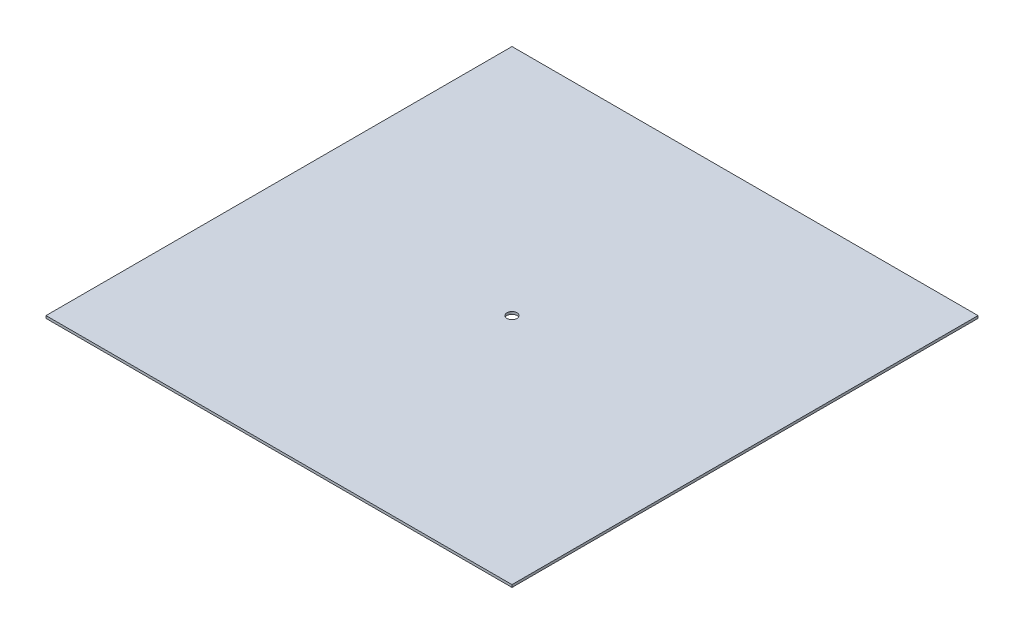
ISO-10303-21;
HEADER;
FILE_DESCRIPTION(('STEP AP214'),'2;1');
FILE_NAME('part.step','',(''),(''),'','','');
FILE_SCHEMA(('AUTOMOTIVE_DESIGN { 1 0 10303 214 1 1 1 1 }'));
ENDSEC;
DATA;
#1=APPLICATION_CONTEXT('core data for automotive mechanical design processes');
#2=APPLICATION_PROTOCOL_DEFINITION('international standard','automotive_design',2000,#1);
#3=PRODUCT_CONTEXT('',#1,'mechanical');
#4=PRODUCT('Part','Part','',(#3));
#5=PRODUCT_RELATED_PRODUCT_CATEGORY('part','',(#4));
#6=PRODUCT_DEFINITION_FORMATION('','',#4);
#7=PRODUCT_DEFINITION_CONTEXT('part definition',#1,'design');
#8=PRODUCT_DEFINITION('design','',#6,#7);
#9=PRODUCT_DEFINITION_SHAPE('','',#8);
#10=(LENGTH_UNIT() NAMED_UNIT(*) SI_UNIT(.MILLI.,.METRE.));
#11=(NAMED_UNIT(*) PLANE_ANGLE_UNIT() SI_UNIT($,.RADIAN.));
#12=(NAMED_UNIT(*) SI_UNIT($,.STERADIAN.) SOLID_ANGLE_UNIT());
#13=UNCERTAINTY_MEASURE_WITH_UNIT(LENGTH_MEASURE(1.E-05),#10,'distance_accuracy_value','');
#14=(GEOMETRIC_REPRESENTATION_CONTEXT(3) GLOBAL_UNCERTAINTY_ASSIGNED_CONTEXT((#13)) GLOBAL_UNIT_ASSIGNED_CONTEXT((#10,
#11,#12)) REPRESENTATION_CONTEXT('',''));
#15=CARTESIAN_POINT('',(0.,0.,0.));
#16=DIRECTION('',(0.,0.,1.));
#17=DIRECTION('',(1.,0.,0.));
#18=AXIS2_PLACEMENT_3D('',#15,#16,#17);
#19=CARTESIAN_POINT('',(-152.4,1.6256,-152.4));
#20=DIRECTION('',(1.,0.,0.));
#21=DIRECTION('',(0.,0.,-1.));
#22=AXIS2_PLACEMENT_3D('',#19,#20,#21);
#23=PLANE('',#22);
#24=DIRECTION('',(0.,0.,1.));
#25=VECTOR('',#24,1.);
#26=CARTESIAN_POINT('',(-152.4,0.,-152.4));
#27=LINE('',#26,#25);
#28=CARTESIAN_POINT('',(-152.4,0.,-152.4));
#29=VERTEX_POINT('',#28);
#30=CARTESIAN_POINT('',(-152.4,0.,152.4));
#31=VERTEX_POINT('',#30);
#32=EDGE_CURVE('E96',#29,#31,#27,.T.);
#33=ORIENTED_EDGE('',*,*,#32,.T.);
#34=DIRECTION('',(0.,-1.,0.));
#35=VECTOR('',#34,1.);
#36=CARTESIAN_POINT('',(-152.4,1.6256,152.4));
#37=LINE('',#36,#35);
#38=CARTESIAN_POINT('',(-152.4,1.6256,152.4));
#39=VERTEX_POINT('',#38);
#40=EDGE_CURVE('E11',#39,#31,#37,.T.);
#41=ORIENTED_EDGE('',*,*,#40,.F.);
#42=DIRECTION('',(0.,0.,1.));
#43=VECTOR('',#42,1.);
#44=CARTESIAN_POINT('',(-152.4,1.6256,-152.4));
#45=LINE('',#44,#43);
#46=CARTESIAN_POINT('',(-152.4,1.6256,-152.4));
#47=VERTEX_POINT('',#46);
#48=EDGE_CURVE('E84',#47,#39,#45,.T.);
#49=ORIENTED_EDGE('',*,*,#48,.F.);
#50=DIRECTION('',(0.,-1.,0.));
#51=VECTOR('',#50,1.);
#52=CARTESIAN_POINT('',(-152.4,1.6256,-152.4));
#53=LINE('',#52,#51);
#54=EDGE_CURVE('E92',#47,#29,#53,.T.);
#55=ORIENTED_EDGE('',*,*,#54,.T.);
#56=EDGE_LOOP('',(#33,#41,#49,#55));
#57=FACE_BOUND('',#56,.T.);
#58=ADVANCED_FACE('F33',(#57),#23,.F.);
#59=CARTESIAN_POINT('',(152.4,1.6256,152.4));
#60=DIRECTION('',(0.,0.,-1.));
#61=DIRECTION('',(-1.,0.,0.));
#62=AXIS2_PLACEMENT_3D('',#59,#60,#61);
#63=PLANE('',#62);
#64=DIRECTION('',(1.,0.,0.));
#65=VECTOR('',#64,1.);
#66=CARTESIAN_POINT('',(152.4,0.,152.4));
#67=LINE('',#66,#65);
#68=CARTESIAN_POINT('',(152.4,0.,152.4));
#69=VERTEX_POINT('',#68);
#70=EDGE_CURVE('E88',#31,#69,#67,.T.);
#71=ORIENTED_EDGE('',*,*,#70,.T.);
#72=DIRECTION('',(0.,-1.,0.));
#73=VECTOR('',#72,1.);
#74=CARTESIAN_POINT('',(152.4,1.6256,152.4));
#75=LINE('',#74,#73);
#76=CARTESIAN_POINT('',(152.4,1.6256,152.4));
#77=VERTEX_POINT('',#76);
#78=EDGE_CURVE('E41',#77,#69,#75,.T.);
#79=ORIENTED_EDGE('',*,*,#78,.F.);
#80=DIRECTION('',(1.,0.,0.));
#81=VECTOR('',#80,1.);
#82=CARTESIAN_POINT('',(152.4,1.6256,152.4));
#83=LINE('',#82,#81);
#84=EDGE_CURVE('E79',#39,#77,#83,.T.);
#85=ORIENTED_EDGE('',*,*,#84,.F.);
#86=ORIENTED_EDGE('',*,*,#40,.T.);
#87=EDGE_LOOP('',(#71,#79,#85,#86));
#88=FACE_BOUND('',#87,.T.);
#89=ADVANCED_FACE('F87',(#88),#63,.F.);
#90=CARTESIAN_POINT('',(152.4,1.6256,-152.4));
#91=DIRECTION('',(-1.,0.,0.));
#92=DIRECTION('',(0.,0.,1.));
#93=AXIS2_PLACEMENT_3D('',#90,#91,#92);
#94=PLANE('',#93);
#95=DIRECTION('',(0.,0.,-1.));
#96=VECTOR('',#95,1.);
#97=CARTESIAN_POINT('',(152.4,0.,-152.4));
#98=LINE('',#97,#96);
#99=CARTESIAN_POINT('',(152.4,0.,-152.4));
#100=VERTEX_POINT('',#99);
#101=EDGE_CURVE('E66',#69,#100,#98,.T.);
#102=ORIENTED_EDGE('',*,*,#101,.T.);
#103=DIRECTION('',(0.,-1.,0.));
#104=VECTOR('',#103,1.);
#105=CARTESIAN_POINT('',(152.4,1.6256,-152.4));
#106=LINE('',#105,#104);
#107=CARTESIAN_POINT('',(152.4,1.6256,-152.4));
#108=VERTEX_POINT('',#107);
#109=EDGE_CURVE('E89',#108,#100,#106,.T.);
#110=ORIENTED_EDGE('',*,*,#109,.F.);
#111=DIRECTION('',(0.,0.,-1.));
#112=VECTOR('',#111,1.);
#113=CARTESIAN_POINT('',(152.4,1.6256,-152.4));
#114=LINE('',#113,#112);
#115=EDGE_CURVE('E82',#77,#108,#114,.T.);
#116=ORIENTED_EDGE('',*,*,#115,.F.);
#117=ORIENTED_EDGE('',*,*,#78,.T.);
#118=EDGE_LOOP('',(#102,#110,#116,#117));
#119=FACE_BOUND('',#118,.T.);
#120=ADVANCED_FACE('F90',(#119),#94,.F.);
#121=CARTESIAN_POINT('',(152.4,1.6256,-152.4));
#122=DIRECTION('',(0.,0.,1.));
#123=DIRECTION('',(1.,0.,0.));
#124=AXIS2_PLACEMENT_3D('',#121,#122,#123);
#125=PLANE('',#124);
#126=DIRECTION('',(-1.,0.,0.));
#127=VECTOR('',#126,1.);
#128=CARTESIAN_POINT('',(152.4,0.,-152.4));
#129=LINE('',#128,#127);
#130=EDGE_CURVE('E72',#100,#29,#129,.T.);
#131=ORIENTED_EDGE('',*,*,#130,.T.);
#132=ORIENTED_EDGE('',*,*,#54,.F.);
#133=DIRECTION('',(-1.,0.,0.));
#134=VECTOR('',#133,1.);
#135=CARTESIAN_POINT('',(152.4,1.6256,-152.4));
#136=LINE('',#135,#134);
#137=EDGE_CURVE('E49',#108,#47,#136,.T.);
#138=ORIENTED_EDGE('',*,*,#137,.F.);
#139=ORIENTED_EDGE('',*,*,#109,.T.);
#140=EDGE_LOOP('',(#131,#132,#138,#139));
#141=FACE_BOUND('',#140,.T.);
#142=ADVANCED_FACE('F104',(#141),#125,.F.);
#143=CARTESIAN_POINT('',(0.,1.6256,0.));
#144=DIRECTION('',(0.,-1.,0.));
#145=DIRECTION('',(0.,0.,-1.));
#146=AXIS2_PLACEMENT_3D('',#143,#144,#145);
#147=PLANE('',#146);
#148=CARTESIAN_POINT('',(0.,1.6256,0.));
#149=DIRECTION('',(0.,1.,0.));
#150=DIRECTION('',(0.,0.,1.));
#151=AXIS2_PLACEMENT_3D('',#148,#149,#150);
#152=CIRCLE('',#151,3.26389999999999);
#153=CARTESIAN_POINT('',(0.,1.6256,3.26389999999999));
#154=VERTEX_POINT('',#153);
#155=EDGE_CURVE('E112',#154,#154,#152,.T.);
#156=ORIENTED_EDGE('',*,*,#155,.F.);
#157=EDGE_LOOP('',(#156));
#158=FACE_BOUND('',#157,.T.);
#159=ORIENTED_EDGE('',*,*,#48,.T.);
#160=ORIENTED_EDGE('',*,*,#84,.T.);
#161=ORIENTED_EDGE('',*,*,#115,.T.);
#162=ORIENTED_EDGE('',*,*,#137,.T.);
#163=EDGE_LOOP('',(#159,#160,#161,#162));
#164=FACE_BOUND('',#163,.T.);
#165=ADVANCED_FACE('F80',(#158,#164),#147,.F.);
#166=CARTESIAN_POINT('',(0.,0.,0.));
#167=DIRECTION('',(0.,-1.,0.));
#168=DIRECTION('',(0.,0.,-1.));
#169=AXIS2_PLACEMENT_3D('',#166,#167,#168);
#170=PLANE('',#169);
#171=CARTESIAN_POINT('',(0.,0.,0.));
#172=DIRECTION('',(0.,1.,0.));
#173=DIRECTION('',(0.,0.,1.));
#174=AXIS2_PLACEMENT_3D('',#171,#172,#173);
#175=CIRCLE('',#174,3.2639);
#176=CARTESIAN_POINT('',(0.,0.,3.2639));
#177=VERTEX_POINT('',#176);
#178=EDGE_CURVE('E99',#177,#177,#175,.T.);
#179=ORIENTED_EDGE('',*,*,#178,.T.);
#180=EDGE_LOOP('',(#179));
#181=FACE_BOUND('',#180,.T.);
#182=ORIENTED_EDGE('',*,*,#32,.F.);
#183=ORIENTED_EDGE('',*,*,#130,.F.);
#184=ORIENTED_EDGE('',*,*,#101,.F.);
#185=ORIENTED_EDGE('',*,*,#70,.F.);
#186=EDGE_LOOP('',(#182,#183,#184,#185));
#187=FACE_BOUND('',#186,.T.);
#188=ADVANCED_FACE('F107',(#181,#187),#170,.T.);
#189=CARTESIAN_POINT('',(0.,1.6256,0.));
#190=DIRECTION('',(0.,1.,0.));
#191=DIRECTION('',(0.,0.,1.));
#192=AXIS2_PLACEMENT_3D('',#189,#190,#191);
#193=CYLINDRICAL_SURFACE('',#192,3.26389999999999);
#194=ORIENTED_EDGE('',*,*,#178,.F.);
#195=EDGE_LOOP('',(#194));
#196=FACE_BOUND('',#195,.T.);
#197=ORIENTED_EDGE('',*,*,#155,.T.);
#198=EDGE_LOOP('',(#197));
#199=FACE_BOUND('',#198,.T.);
#200=ADVANCED_FACE('F116',(#196,#199),#193,.F.);
#201=CLOSED_SHELL('',(#58,#89,#120,#142,#165,#188,#200));
#202=MANIFOLD_SOLID_BREP('B2',#201);
#203=ADVANCED_BREP_SHAPE_REPRESENTATION('',(#18,#202),#14);
#204=SHAPE_DEFINITION_REPRESENTATION(#9,#203);
ENDSEC;
END-ISO-10303-21;
